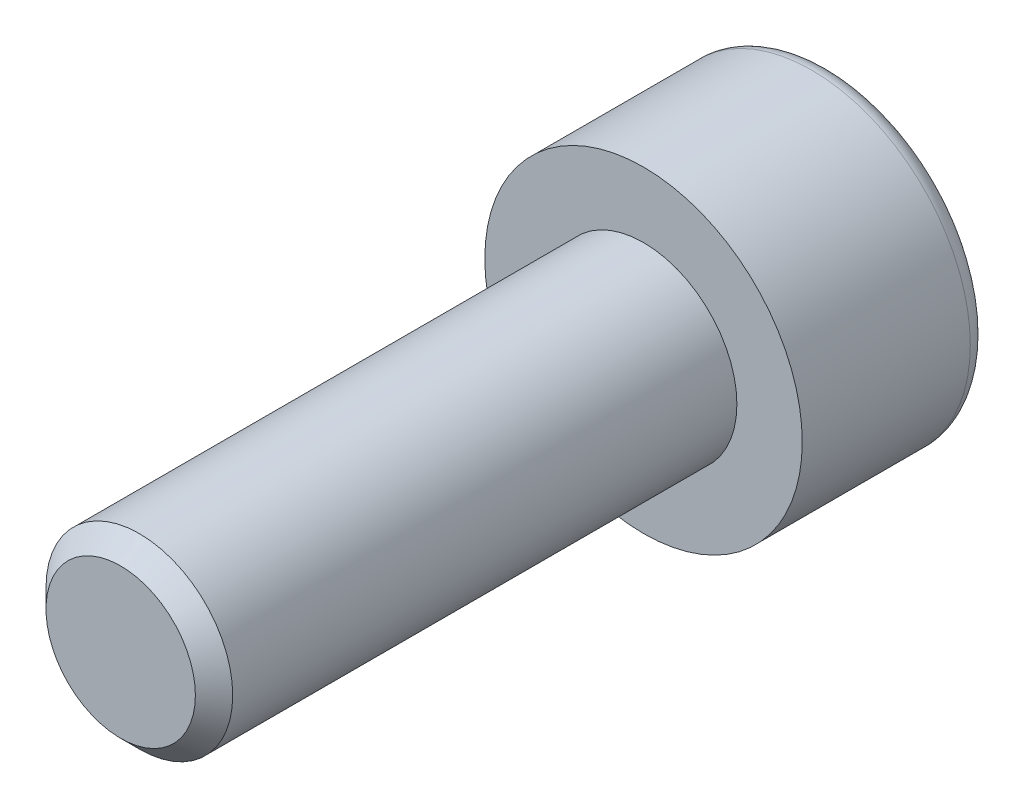
ISO-10303-21;
HEADER;
FILE_DESCRIPTION(('STEP AP214'),'2;1');
FILE_NAME('part.step','',(''),(''),'','','');
FILE_SCHEMA(('AUTOMOTIVE_DESIGN { 1 0 10303 214 1 1 1 1 }'));
ENDSEC;
DATA;
#1=APPLICATION_CONTEXT('core data for automotive mechanical design processes');
#2=APPLICATION_PROTOCOL_DEFINITION('international standard','automotive_design',2000,#1);
#3=PRODUCT_CONTEXT('',#1,'mechanical');
#4=PRODUCT('Part','Part','',(#3));
#5=PRODUCT_RELATED_PRODUCT_CATEGORY('part','',(#4));
#6=PRODUCT_DEFINITION_FORMATION('','',#4);
#7=PRODUCT_DEFINITION_CONTEXT('part definition',#1,'design');
#8=PRODUCT_DEFINITION('design','',#6,#7);
#9=PRODUCT_DEFINITION_SHAPE('','',#8);
#10=(LENGTH_UNIT() NAMED_UNIT(*) SI_UNIT(.MILLI.,.METRE.));
#11=(NAMED_UNIT(*) PLANE_ANGLE_UNIT() SI_UNIT($,.RADIAN.));
#12=(NAMED_UNIT(*) SI_UNIT($,.STERADIAN.) SOLID_ANGLE_UNIT());
#13=UNCERTAINTY_MEASURE_WITH_UNIT(LENGTH_MEASURE(1.E-05),#10,'distance_accuracy_value','');
#14=(GEOMETRIC_REPRESENTATION_CONTEXT(3) GLOBAL_UNCERTAINTY_ASSIGNED_CONTEXT((#13)) GLOBAL_UNIT_ASSIGNED_CONTEXT((#10,
#11,#12)) REPRESENTATION_CONTEXT('',''));
#15=CARTESIAN_POINT('',(0.,0.,0.));
#16=DIRECTION('',(0.,0.,1.));
#17=DIRECTION('',(1.,0.,0.));
#18=AXIS2_PLACEMENT_3D('',#15,#16,#17);
#19=CARTESIAN_POINT('',(0.,0.,-5.));
#20=DIRECTION('',(0.,0.,1.));
#21=DIRECTION('',(1.,0.,0.));
#22=AXIS2_PLACEMENT_3D('',#19,#20,#21);
#23=PLANE('',#22);
#24=CARTESIAN_POINT('',(0.,0.,-5.));
#25=DIRECTION('',(0.,0.,-1.));
#26=DIRECTION('',(-1.,0.,0.));
#27=AXIS2_PLACEMENT_3D('',#24,#25,#26);
#28=CIRCLE('',#27,3.75);
#29=CARTESIAN_POINT('',(-3.75000000000002,0.,-5.));
#30=VERTEX_POINT('',#29);
#31=EDGE_CURVE('E141',#30,#30,#28,.T.);
#32=ORIENTED_EDGE('',*,*,#31,.T.);
#33=EDGE_LOOP('',(#32));
#34=FACE_BOUND('',#33,.T.);
#35=DIRECTION('',(-0.866025403784441,0.499999999999999,0.));
#36=VECTOR('',#35,1.);
#37=CARTESIAN_POINT('',(0.,2.30940107675838,-5.));
#38=LINE('',#37,#36);
#39=CARTESIAN_POINT('',(1.99999999999993,1.15470053837911,-5.));
#40=VERTEX_POINT('',#39);
#41=CARTESIAN_POINT('',(0.,2.30940107675838,-5.));
#42=VERTEX_POINT('',#41);
#43=EDGE_CURVE('E45',#40,#42,#38,.T.);
#44=ORIENTED_EDGE('',*,*,#43,.T.);
#45=DIRECTION('',(-0.866025403784439,-0.5,0.));
#46=VECTOR('',#45,1.);
#47=CARTESIAN_POINT('',(0.,2.30940107675838,-5.));
#48=LINE('',#47,#46);
#49=CARTESIAN_POINT('',(-2.00000000000002,1.15470053837911,-5.));
#50=VERTEX_POINT('',#49);
#51=EDGE_CURVE('E85',#42,#50,#48,.T.);
#52=ORIENTED_EDGE('',*,*,#51,.T.);
#53=DIRECTION('',(0.,-1.,0.));
#54=VECTOR('',#53,1.);
#55=CARTESIAN_POINT('',(-2.00000000000003,-1.15470053837929,-5.));
#56=LINE('',#55,#54);
#57=CARTESIAN_POINT('',(-2.00000000000003,-1.15470053837929,-5.));
#58=VERTEX_POINT('',#57);
#59=EDGE_CURVE('E93',#50,#58,#56,.T.);
#60=ORIENTED_EDGE('',*,*,#59,.T.);
#61=DIRECTION('',(0.866025403784439,-0.500000000000003,0.));
#62=VECTOR('',#61,1.);
#63=CARTESIAN_POINT('',(0.,-2.30940107675855,-5.));
#64=LINE('',#63,#62);
#65=CARTESIAN_POINT('',(0.,-2.30940107675855,-5.));
#66=VERTEX_POINT('',#65);
#67=EDGE_CURVE('E111',#58,#66,#64,.T.);
#68=ORIENTED_EDGE('',*,*,#67,.T.);
#69=DIRECTION('',(0.866025403784441,0.499999999999997,0.));
#70=VECTOR('',#69,1.);
#71=CARTESIAN_POINT('',(0.,-2.30940107675855,-5.));
#72=LINE('',#71,#70);
#73=CARTESIAN_POINT('',(1.99999999999995,-1.15470053837932,-5.));
#74=VERTEX_POINT('',#73);
#75=EDGE_CURVE('E114',#66,#74,#72,.T.);
#76=ORIENTED_EDGE('',*,*,#75,.T.);
#77=DIRECTION('',(0.,1.,0.));
#78=VECTOR('',#77,1.);
#79=CARTESIAN_POINT('',(1.99999999999995,-1.15470053837932,-5.));
#80=LINE('',#79,#78);
#81=EDGE_CURVE('E104',#74,#40,#80,.T.);
#82=ORIENTED_EDGE('',*,*,#81,.T.);
#83=EDGE_LOOP('',(#44,#52,#60,#68,#76,#82));
#84=FACE_BOUND('',#83,.T.);
#85=ADVANCED_FACE('F31',(#34,#84),#23,.F.);
#86=CARTESIAN_POINT('',(0.,0.,-4.5));
#87=DIRECTION('',(0.,0.,-1.));
#88=DIRECTION('',(-1.,0.,0.));
#89=AXIS2_PLACEMENT_3D('',#86,#87,#88);
#90=TOROIDAL_SURFACE('',#89,3.75,0.5);
#91=ORIENTED_EDGE('',*,*,#31,.F.);
#92=EDGE_LOOP('',(#91));
#93=FACE_BOUND('',#92,.T.);
#94=CARTESIAN_POINT('',(0.,0.,-4.5));
#95=DIRECTION('',(0.,0.,-1.));
#96=DIRECTION('',(-1.,0.,0.));
#97=AXIS2_PLACEMENT_3D('',#94,#95,#96);
#98=CIRCLE('',#97,4.25);
#99=CARTESIAN_POINT('',(-4.25000000000002,0.,-4.5));
#100=VERTEX_POINT('',#99);
#101=EDGE_CURVE('E138',#100,#100,#98,.T.);
#102=ORIENTED_EDGE('',*,*,#101,.T.);
#103=EDGE_LOOP('',(#102));
#104=FACE_BOUND('',#103,.T.);
#105=ADVANCED_FACE('F160',(#93,#104),#90,.T.);
#106=CARTESIAN_POINT('',(0.,0.,0.));
#107=DIRECTION('',(0.,0.,-1.));
#108=DIRECTION('',(-1.,0.,0.));
#109=AXIS2_PLACEMENT_3D('',#106,#107,#108);
#110=CYLINDRICAL_SURFACE('',#109,4.25);
#111=ORIENTED_EDGE('',*,*,#101,.F.);
#112=EDGE_LOOP('',(#111));
#113=FACE_BOUND('',#112,.T.);
#114=CARTESIAN_POINT('',(0.,0.,0.));
#115=DIRECTION('',(0.,0.,-1.));
#116=DIRECTION('',(-1.,0.,0.));
#117=AXIS2_PLACEMENT_3D('',#114,#115,#116);
#118=CIRCLE('',#117,4.25);
#119=CARTESIAN_POINT('',(-4.25000000000001,0.,0.));
#120=VERTEX_POINT('',#119);
#121=EDGE_CURVE('E99',#120,#120,#118,.T.);
#122=ORIENTED_EDGE('',*,*,#121,.T.);
#123=EDGE_LOOP('',(#122));
#124=FACE_BOUND('',#123,.T.);
#125=ADVANCED_FACE('F165',(#113,#124),#110,.T.);
#126=CARTESIAN_POINT('',(0.,0.,0.));
#127=DIRECTION('',(0.,0.,-1.));
#128=DIRECTION('',(-1.,0.,0.));
#129=AXIS2_PLACEMENT_3D('',#126,#127,#128);
#130=PLANE('',#129);
#131=CARTESIAN_POINT('',(0.,0.,0.));
#132=DIRECTION('',(0.,0.,1.));
#133=DIRECTION('',(1.,0.,0.));
#134=AXIS2_PLACEMENT_3D('',#131,#132,#133);
#135=CIRCLE('',#134,2.5);
#136=CARTESIAN_POINT('',(2.5,0.,0.));
#137=VERTEX_POINT('',#136);
#138=EDGE_CURVE('E105',#137,#137,#135,.T.);
#139=ORIENTED_EDGE('',*,*,#138,.F.);
#140=EDGE_LOOP('',(#139));
#141=FACE_BOUND('',#140,.T.);
#142=ORIENTED_EDGE('',*,*,#121,.F.);
#143=EDGE_LOOP('',(#142));
#144=FACE_BOUND('',#143,.T.);
#145=ADVANCED_FACE('F173',(#141,#144),#130,.F.);
#146=CARTESIAN_POINT('',(0.,2.30940107675838,-2.5));
#147=DIRECTION('',(-0.499999999999999,-0.86602540378444,0.));
#148=DIRECTION('',(0.866025403784441,-0.499999999999999,0.));
#149=AXIS2_PLACEMENT_3D('',#146,#147,#148);
#150=PLANE('',#149);
#151=ORIENTED_EDGE('',*,*,#43,.F.);
#152=DIRECTION('',(0.,0.,-1.));
#153=VECTOR('',#152,1.);
#154=CARTESIAN_POINT('',(1.99999999999993,1.15470053837911,-2.5));
#155=LINE('',#154,#153);
#156=CARTESIAN_POINT('',(1.99999999999993,1.15470053837911,-2.5));
#157=VERTEX_POINT('',#156);
#158=EDGE_CURVE('E127',#157,#40,#155,.T.);
#159=ORIENTED_EDGE('',*,*,#158,.F.);
#160=DIRECTION('',(-0.866025403784441,0.499999999999999,0.));
#161=VECTOR('',#160,1.);
#162=CARTESIAN_POINT('',(0.,2.30940107675838,-2.5));
#163=LINE('',#162,#161);
#164=CARTESIAN_POINT('',(0.,2.30940107675838,-2.5));
#165=VERTEX_POINT('',#164);
#166=EDGE_CURVE('E98',#157,#165,#163,.T.);
#167=ORIENTED_EDGE('',*,*,#166,.T.);
#168=DIRECTION('',(0.,0.,-1.));
#169=VECTOR('',#168,1.);
#170=CARTESIAN_POINT('',(0.,2.30940107675838,-2.5));
#171=LINE('',#170,#169);
#172=EDGE_CURVE('E87',#165,#42,#171,.T.);
#173=ORIENTED_EDGE('',*,*,#172,.T.);
#174=EDGE_LOOP('',(#151,#159,#167,#173));
#175=FACE_BOUND('',#174,.T.);
#176=ADVANCED_FACE('F96',(#175),#150,.T.);
#177=CARTESIAN_POINT('',(0.,2.30940107675838,-2.5));
#178=DIRECTION('',(0.500000000000001,-0.866025403784439,0.));
#179=DIRECTION('',(0.866025403784439,0.5,0.));
#180=AXIS2_PLACEMENT_3D('',#177,#178,#179);
#181=PLANE('',#180);
#182=ORIENTED_EDGE('',*,*,#51,.F.);
#183=ORIENTED_EDGE('',*,*,#172,.F.);
#184=DIRECTION('',(-0.866025403784439,-0.5,0.));
#185=VECTOR('',#184,1.);
#186=CARTESIAN_POINT('',(0.,2.30940107675838,-2.5));
#187=LINE('',#186,#185);
#188=CARTESIAN_POINT('',(-2.00000000000002,1.15470053837911,-2.5));
#189=VERTEX_POINT('',#188);
#190=EDGE_CURVE('E118',#165,#189,#187,.T.);
#191=ORIENTED_EDGE('',*,*,#190,.T.);
#192=DIRECTION('',(0.,0.,-1.));
#193=VECTOR('',#192,1.);
#194=CARTESIAN_POINT('',(-2.00000000000002,1.15470053837911,-2.5));
#195=LINE('',#194,#193);
#196=EDGE_CURVE('E89',#189,#50,#195,.T.);
#197=ORIENTED_EDGE('',*,*,#196,.T.);
#198=EDGE_LOOP('',(#182,#183,#191,#197));
#199=FACE_BOUND('',#198,.T.);
#200=ADVANCED_FACE('F86',(#199),#181,.T.);
#201=CARTESIAN_POINT('',(-2.00000000000003,-1.15470053837929,-2.5));
#202=DIRECTION('',(1.,0.,0.));
#203=DIRECTION('',(0.,0.,-1.));
#204=AXIS2_PLACEMENT_3D('',#201,#202,#203);
#205=PLANE('',#204);
#206=ORIENTED_EDGE('',*,*,#59,.F.);
#207=ORIENTED_EDGE('',*,*,#196,.F.);
#208=DIRECTION('',(0.,-1.,0.));
#209=VECTOR('',#208,1.);
#210=CARTESIAN_POINT('',(-2.00000000000003,-1.15470053837929,-2.5));
#211=LINE('',#210,#209);
#212=CARTESIAN_POINT('',(-2.00000000000003,-1.15470053837929,-2.5));
#213=VERTEX_POINT('',#212);
#214=EDGE_CURVE('E120',#189,#213,#211,.T.);
#215=ORIENTED_EDGE('',*,*,#214,.T.);
#216=DIRECTION('',(0.,0.,-1.));
#217=VECTOR('',#216,1.);
#218=CARTESIAN_POINT('',(-2.00000000000003,-1.15470053837929,-2.5));
#219=LINE('',#218,#217);
#220=EDGE_CURVE('E133',#213,#58,#219,.T.);
#221=ORIENTED_EDGE('',*,*,#220,.T.);
#222=EDGE_LOOP('',(#206,#207,#215,#221));
#223=FACE_BOUND('',#222,.T.);
#224=ADVANCED_FACE('F188',(#223),#205,.T.);
#225=CARTESIAN_POINT('',(0.,-2.30940107675855,-2.5));
#226=DIRECTION('',(0.500000000000002,0.866025403784438,0.));
#227=DIRECTION('',(-0.866025403784439,0.500000000000003,0.));
#228=AXIS2_PLACEMENT_3D('',#225,#226,#227);
#229=PLANE('',#228);
#230=ORIENTED_EDGE('',*,*,#67,.F.);
#231=ORIENTED_EDGE('',*,*,#220,.F.);
#232=DIRECTION('',(0.866025403784439,-0.500000000000003,0.));
#233=VECTOR('',#232,1.);
#234=CARTESIAN_POINT('',(0.,-2.30940107675855,-2.5));
#235=LINE('',#234,#233);
#236=CARTESIAN_POINT('',(0.,-2.30940107675855,-2.5));
#237=VERTEX_POINT('',#236);
#238=EDGE_CURVE('E122',#213,#237,#235,.T.);
#239=ORIENTED_EDGE('',*,*,#238,.T.);
#240=DIRECTION('',(0.,0.,-1.));
#241=VECTOR('',#240,1.);
#242=CARTESIAN_POINT('',(0.,-2.30940107675855,-2.5));
#243=LINE('',#242,#241);
#244=EDGE_CURVE('E131',#237,#66,#243,.T.);
#245=ORIENTED_EDGE('',*,*,#244,.T.);
#246=EDGE_LOOP('',(#230,#231,#239,#245));
#247=FACE_BOUND('',#246,.T.);
#248=ADVANCED_FACE('F191',(#247),#229,.T.);
#249=CARTESIAN_POINT('',(0.,-2.30940107675855,-2.5));
#250=DIRECTION('',(-0.499999999999998,0.86602540378444,0.));
#251=DIRECTION('',(-0.866025403784441,-0.499999999999997,0.));
#252=AXIS2_PLACEMENT_3D('',#249,#250,#251);
#253=PLANE('',#252);
#254=ORIENTED_EDGE('',*,*,#75,.F.);
#255=ORIENTED_EDGE('',*,*,#244,.F.);
#256=DIRECTION('',(0.866025403784441,0.499999999999997,0.));
#257=VECTOR('',#256,1.);
#258=CARTESIAN_POINT('',(0.,-2.30940107675855,-2.5));
#259=LINE('',#258,#257);
#260=CARTESIAN_POINT('',(1.99999999999995,-1.15470053837932,-2.5));
#261=VERTEX_POINT('',#260);
#262=EDGE_CURVE('E124',#237,#261,#259,.T.);
#263=ORIENTED_EDGE('',*,*,#262,.T.);
#264=DIRECTION('',(0.,0.,-1.));
#265=VECTOR('',#264,1.);
#266=CARTESIAN_POINT('',(1.99999999999995,-1.15470053837932,-2.5));
#267=LINE('',#266,#265);
#268=EDGE_CURVE('E129',#261,#74,#267,.T.);
#269=ORIENTED_EDGE('',*,*,#268,.T.);
#270=EDGE_LOOP('',(#254,#255,#263,#269));
#271=FACE_BOUND('',#270,.T.);
#272=ADVANCED_FACE('F195',(#271),#253,.T.);
#273=CARTESIAN_POINT('',(1.99999999999995,-1.15470053837932,-2.5));
#274=DIRECTION('',(-1.,0.,0.));
#275=DIRECTION('',(0.,0.,1.));
#276=AXIS2_PLACEMENT_3D('',#273,#274,#275);
#277=PLANE('',#276);
#278=ORIENTED_EDGE('',*,*,#81,.F.);
#279=ORIENTED_EDGE('',*,*,#268,.F.);
#280=DIRECTION('',(0.,1.,0.));
#281=VECTOR('',#280,1.);
#282=CARTESIAN_POINT('',(1.99999999999995,-1.15470053837932,-2.5));
#283=LINE('',#282,#281);
#284=EDGE_CURVE('E52',#261,#157,#283,.T.);
#285=ORIENTED_EDGE('',*,*,#284,.T.);
#286=ORIENTED_EDGE('',*,*,#158,.T.);
#287=EDGE_LOOP('',(#278,#279,#285,#286));
#288=FACE_BOUND('',#287,.T.);
#289=ADVANCED_FACE('F199',(#288),#277,.T.);
#290=CARTESIAN_POINT('',(1.99999999999993,1.15470053837911,-2.5));
#291=DIRECTION('',(0.,0.,1.));
#292=DIRECTION('',(1.,0.,0.));
#293=AXIS2_PLACEMENT_3D('',#290,#291,#292);
#294=PLANE('',#293);
#295=ORIENTED_EDGE('',*,*,#166,.F.);
#296=ORIENTED_EDGE('',*,*,#284,.F.);
#297=ORIENTED_EDGE('',*,*,#262,.F.);
#298=ORIENTED_EDGE('',*,*,#238,.F.);
#299=ORIENTED_EDGE('',*,*,#214,.F.);
#300=ORIENTED_EDGE('',*,*,#190,.F.);
#301=EDGE_LOOP('',(#295,#296,#297,#298,#299,#300));
#302=FACE_BOUND('',#301,.T.);
#303=ADVANCED_FACE('F203',(#302),#294,.F.);
#304=CARTESIAN_POINT('',(0.,0.,14.));
#305=DIRECTION('',(0.,0.,1.));
#306=DIRECTION('',(1.,0.,0.));
#307=AXIS2_PLACEMENT_3D('',#304,#305,#306);
#308=PLANE('',#307);
#309=CARTESIAN_POINT('',(0.,0.,14.));
#310=DIRECTION('',(0.,0.,1.));
#311=DIRECTION('',(1.,0.,0.));
#312=AXIS2_PLACEMENT_3D('',#309,#310,#311);
#313=CIRCLE('',#312,1.99999999999999);
#314=CARTESIAN_POINT('',(1.99999999999999,0.,14.));
#315=VERTEX_POINT('',#314);
#316=EDGE_CURVE('E38',#315,#315,#313,.T.);
#317=ORIENTED_EDGE('',*,*,#316,.T.);
#318=EDGE_LOOP('',(#317));
#319=FACE_BOUND('',#318,.T.);
#320=ADVANCED_FACE('F146',(#319),#308,.T.);
#321=CARTESIAN_POINT('',(0.,0.,0.));
#322=DIRECTION('',(0.,0.,1.));
#323=DIRECTION('',(1.,0.,0.));
#324=AXIS2_PLACEMENT_3D('',#321,#322,#323);
#325=CYLINDRICAL_SURFACE('',#324,2.5);
#326=CARTESIAN_POINT('',(0.,0.,13.5));
#327=DIRECTION('',(0.,0.,1.));
#328=DIRECTION('',(1.,0.,0.));
#329=AXIS2_PLACEMENT_3D('',#326,#327,#328);
#330=CIRCLE('',#329,2.5);
#331=CARTESIAN_POINT('',(2.5,0.,13.5));
#332=VERTEX_POINT('',#331);
#333=EDGE_CURVE('E11',#332,#332,#330,.F.);
#334=ORIENTED_EDGE('',*,*,#333,.T.);
#335=EDGE_LOOP('',(#334));
#336=FACE_BOUND('',#335,.T.);
#337=ORIENTED_EDGE('',*,*,#138,.T.);
#338=EDGE_LOOP('',(#337));
#339=FACE_BOUND('',#338,.T.);
#340=ADVANCED_FACE('F150',(#336,#339),#325,.T.);
#341=CARTESIAN_POINT('',(0.,0.,14.));
#342=DIRECTION('',(0.,0.,-1.));
#343=DIRECTION('',(-1.,0.,0.));
#344=AXIS2_PLACEMENT_3D('',#341,#342,#343);
#345=CONICAL_SURFACE('',#344,1.99999999999999,0.785398163397453);
#346=ORIENTED_EDGE('',*,*,#333,.F.);
#347=EDGE_LOOP('',(#346));
#348=FACE_BOUND('',#347,.T.);
#349=ORIENTED_EDGE('',*,*,#316,.F.);
#350=EDGE_LOOP('',(#349));
#351=FACE_BOUND('',#350,.T.);
#352=ADVANCED_FACE('F148',(#348,#351),#345,.T.);
#353=CLOSED_SHELL('',(#85,#105,#125,#145,#176,#200,#224,#248,#272,#289,#303,#320,#340,#352));
#354=MANIFOLD_SOLID_BREP('B2',#353);
#355=ADVANCED_BREP_SHAPE_REPRESENTATION('',(#18,#354),#14);
#356=SHAPE_DEFINITION_REPRESENTATION(#9,#355);
ENDSEC;
END-ISO-10303-21;
